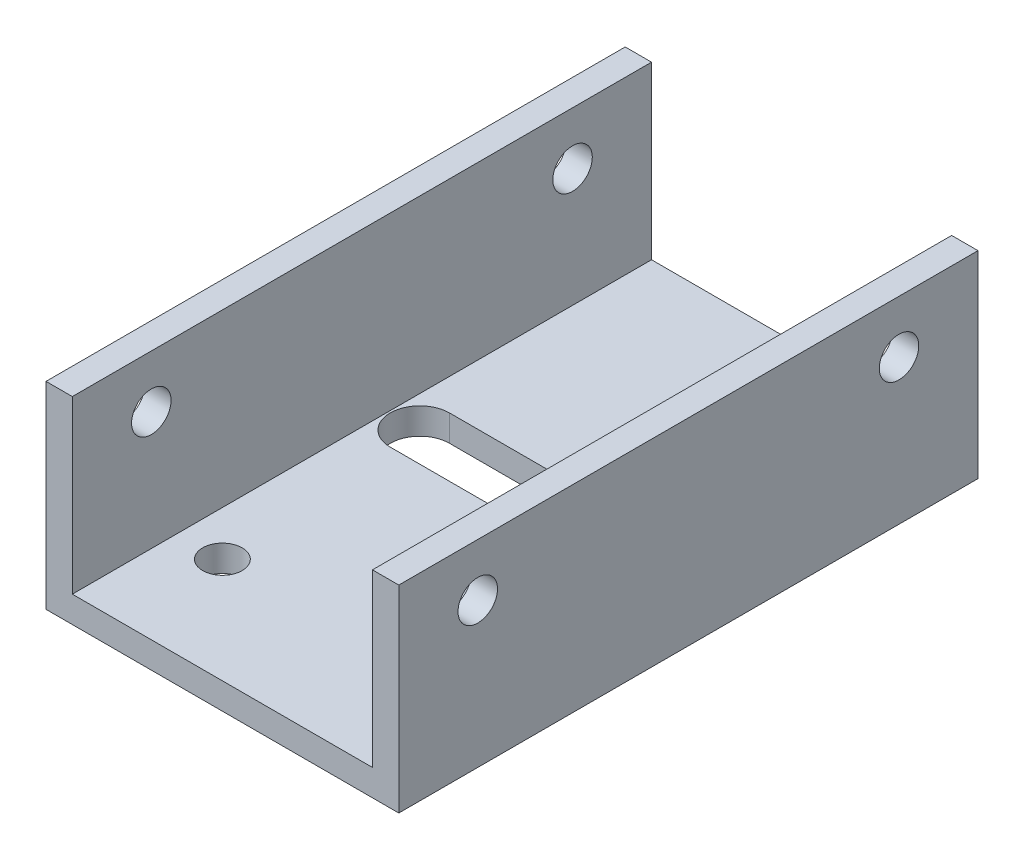
ISO-10303-21;
HEADER;
FILE_DESCRIPTION(('STEP AP214'),'2;1');
FILE_NAME('part.step','',(''),(''),'','','');
FILE_SCHEMA(('AUTOMOTIVE_DESIGN { 1 0 10303 214 1 1 1 1 }'));
ENDSEC;
DATA;
#1=APPLICATION_CONTEXT('core data for automotive mechanical design processes');
#2=APPLICATION_PROTOCOL_DEFINITION('international standard','automotive_design',2000,#1);
#3=PRODUCT_CONTEXT('',#1,'mechanical');
#4=PRODUCT('Part','Part','',(#3));
#5=PRODUCT_RELATED_PRODUCT_CATEGORY('part','',(#4));
#6=PRODUCT_DEFINITION_FORMATION('','',#4);
#7=PRODUCT_DEFINITION_CONTEXT('part definition',#1,'design');
#8=PRODUCT_DEFINITION('design','',#6,#7);
#9=PRODUCT_DEFINITION_SHAPE('','',#8);
#10=(LENGTH_UNIT() NAMED_UNIT(*) SI_UNIT(.MILLI.,.METRE.));
#11=(NAMED_UNIT(*) PLANE_ANGLE_UNIT() SI_UNIT($,.RADIAN.));
#12=(NAMED_UNIT(*) SI_UNIT($,.STERADIAN.) SOLID_ANGLE_UNIT());
#13=UNCERTAINTY_MEASURE_WITH_UNIT(LENGTH_MEASURE(1.E-05),#10,'distance_accuracy_value','');
#14=(GEOMETRIC_REPRESENTATION_CONTEXT(3) GLOBAL_UNCERTAINTY_ASSIGNED_CONTEXT((#13)) GLOBAL_UNIT_ASSIGNED_CONTEXT((#10,
#11,#12)) REPRESENTATION_CONTEXT('',''));
#15=CARTESIAN_POINT('',(0.,0.,0.));
#16=DIRECTION('',(0.,0.,1.));
#17=DIRECTION('',(1.,0.,0.));
#18=AXIS2_PLACEMENT_3D('',#15,#16,#17);
#19=CARTESIAN_POINT('',(0.,0.,44.));
#20=DIRECTION('',(0.,1.,0.));
#21=DIRECTION('',(0.,0.,1.));
#22=AXIS2_PLACEMENT_3D('',#19,#20,#21);
#23=PLANE('',#22);
#24=CARTESIAN_POINT('',(13.4,0.,8.));
#25=DIRECTION('',(0.,-1.,0.));
#26=DIRECTION('',(0.,0.,-1.));
#27=AXIS2_PLACEMENT_3D('',#24,#25,#26);
#28=CIRCLE('',#27,1.5);
#29=CARTESIAN_POINT('',(13.4,0.,6.5));
#30=VERTEX_POINT('',#29);
#31=EDGE_CURVE('E296',#30,#30,#28,.T.);
#32=ORIENTED_EDGE('',*,*,#31,.F.);
#33=EDGE_LOOP('',(#32));
#34=FACE_BOUND('',#33,.T.);
#35=CARTESIAN_POINT('',(21.4,0.,36.));
#36=DIRECTION('',(0.,-1.,0.));
#37=DIRECTION('',(0.,0.,-1.));
#38=AXIS2_PLACEMENT_3D('',#35,#36,#37);
#39=CIRCLE('',#38,1.5);
#40=CARTESIAN_POINT('',(21.4,0.,34.5));
#41=VERTEX_POINT('',#40);
#42=EDGE_CURVE('E301',#41,#41,#39,.T.);
#43=ORIENTED_EDGE('',*,*,#42,.F.);
#44=EDGE_LOOP('',(#43));
#45=FACE_BOUND('',#44,.T.);
#46=CARTESIAN_POINT('',(5.4,0.,36.));
#47=DIRECTION('',(0.,-1.,0.));
#48=DIRECTION('',(0.,0.,-1.));
#49=AXIS2_PLACEMENT_3D('',#46,#47,#48);
#50=CIRCLE('',#49,1.5);
#51=CARTESIAN_POINT('',(5.4,0.,34.5));
#52=VERTEX_POINT('',#51);
#53=EDGE_CURVE('E297',#52,#52,#50,.T.);
#54=ORIENTED_EDGE('',*,*,#53,.F.);
#55=EDGE_LOOP('',(#54));
#56=FACE_BOUND('',#55,.T.);
#57=DIRECTION('',(1.,0.,0.));
#58=VECTOR('',#57,1.);
#59=CARTESIAN_POINT('',(0.,0.,0.));
#60=LINE('',#59,#58);
#61=CARTESIAN_POINT('',(0.,0.,0.));
#62=VERTEX_POINT('',#61);
#63=CARTESIAN_POINT('',(26.8,0.,0.));
#64=VERTEX_POINT('',#63);
#65=EDGE_CURVE('E195',#62,#64,#60,.T.);
#66=ORIENTED_EDGE('',*,*,#65,.T.);
#67=DIRECTION('',(0.,0.,-1.));
#68=VECTOR('',#67,1.);
#69=CARTESIAN_POINT('',(26.8,0.,44.));
#70=LINE('',#69,#68);
#71=CARTESIAN_POINT('',(26.8,0.,44.));
#72=VERTEX_POINT('',#71);
#73=EDGE_CURVE('E239',#72,#64,#70,.T.);
#74=ORIENTED_EDGE('',*,*,#73,.F.);
#75=DIRECTION('',(1.,0.,0.));
#76=VECTOR('',#75,1.);
#77=CARTESIAN_POINT('',(0.,0.,44.));
#78=LINE('',#77,#76);
#79=CARTESIAN_POINT('',(0.,0.,44.));
#80=VERTEX_POINT('',#79);
#81=EDGE_CURVE('E168',#80,#72,#78,.T.);
#82=ORIENTED_EDGE('',*,*,#81,.F.);
#83=DIRECTION('',(0.,0.,-1.));
#84=VECTOR('',#83,1.);
#85=CARTESIAN_POINT('',(0.,0.,44.));
#86=LINE('',#85,#84);
#87=EDGE_CURVE('E243',#80,#62,#86,.T.);
#88=ORIENTED_EDGE('',*,*,#87,.T.);
#89=EDGE_LOOP('',(#66,#74,#82,#88));
#90=FACE_BOUND('',#89,.T.);
#91=DIRECTION('',(-1.,0.,0.));
#92=VECTOR('',#91,1.);
#93=CARTESIAN_POINT('',(0.,0.,17.75));
#94=LINE('',#93,#92);
#95=CARTESIAN_POINT('',(22.4,0.,17.75));
#96=VERTEX_POINT('',#95);
#97=CARTESIAN_POINT('',(4.4,0.,17.75));
#98=VERTEX_POINT('',#97);
#99=EDGE_CURVE('E57',#96,#98,#94,.T.);
#100=ORIENTED_EDGE('',*,*,#99,.T.);
#101=CARTESIAN_POINT('',(4.4,0.,20.));
#102=DIRECTION('',(0.,-1.,0.));
#103=DIRECTION('',(0.,0.,-1.));
#104=AXIS2_PLACEMENT_3D('',#101,#102,#103);
#105=CIRCLE('',#104,2.25);
#106=CARTESIAN_POINT('',(4.4,0.,22.25));
#107=VERTEX_POINT('',#106);
#108=EDGE_CURVE('E149',#107,#98,#105,.T.);
#109=ORIENTED_EDGE('',*,*,#108,.F.);
#110=DIRECTION('',(-1.,0.,0.));
#111=VECTOR('',#110,1.);
#112=CARTESIAN_POINT('',(0.,0.,22.25));
#113=LINE('',#112,#111);
#114=CARTESIAN_POINT('',(22.4,0.,22.25));
#115=VERTEX_POINT('',#114);
#116=EDGE_CURVE('E133',#115,#107,#113,.T.);
#117=ORIENTED_EDGE('',*,*,#116,.F.);
#118=CARTESIAN_POINT('',(22.4,0.,20.));
#119=DIRECTION('',(0.,-1.,0.));
#120=DIRECTION('',(0.,0.,-1.));
#121=AXIS2_PLACEMENT_3D('',#118,#119,#120);
#122=CIRCLE('',#121,2.25);
#123=EDGE_CURVE('E143',#96,#115,#122,.T.);
#124=ORIENTED_EDGE('',*,*,#123,.F.);
#125=EDGE_LOOP('',(#100,#109,#117,#124));
#126=FACE_BOUND('',#125,.T.);
#127=ADVANCED_FACE('F39',(#34,#45,#56,#90,#126),#23,.F.);
#128=CARTESIAN_POINT('',(2.,2.,44.));
#129=DIRECTION('',(0.,-1.,0.));
#130=DIRECTION('',(0.,0.,-1.));
#131=AXIS2_PLACEMENT_3D('',#128,#129,#130);
#132=PLANE('',#131);
#133=CARTESIAN_POINT('',(13.4,2.,8.));
#134=DIRECTION('',(0.,-1.,0.));
#135=DIRECTION('',(0.,0.,-1.));
#136=AXIS2_PLACEMENT_3D('',#133,#134,#135);
#137=CIRCLE('',#136,1.5);
#138=CARTESIAN_POINT('',(13.4,2.,6.5));
#139=VERTEX_POINT('',#138);
#140=EDGE_CURVE('E196',#139,#139,#137,.T.);
#141=ORIENTED_EDGE('',*,*,#140,.T.);
#142=EDGE_LOOP('',(#141));
#143=FACE_BOUND('',#142,.T.);
#144=CARTESIAN_POINT('',(21.4,2.,36.));
#145=DIRECTION('',(0.,-1.,0.));
#146=DIRECTION('',(0.,0.,-1.));
#147=AXIS2_PLACEMENT_3D('',#144,#145,#146);
#148=CIRCLE('',#147,1.5);
#149=CARTESIAN_POINT('',(21.4,2.,34.5));
#150=VERTEX_POINT('',#149);
#151=EDGE_CURVE('E258',#150,#150,#148,.T.);
#152=ORIENTED_EDGE('',*,*,#151,.T.);
#153=EDGE_LOOP('',(#152));
#154=FACE_BOUND('',#153,.T.);
#155=CARTESIAN_POINT('',(5.4,2.,36.));
#156=DIRECTION('',(0.,-1.,0.));
#157=DIRECTION('',(0.,0.,-1.));
#158=AXIS2_PLACEMENT_3D('',#155,#156,#157);
#159=CIRCLE('',#158,1.5);
#160=CARTESIAN_POINT('',(5.4,2.,34.5));
#161=VERTEX_POINT('',#160);
#162=EDGE_CURVE('E159',#161,#161,#159,.T.);
#163=ORIENTED_EDGE('',*,*,#162,.T.);
#164=EDGE_LOOP('',(#163));
#165=FACE_BOUND('',#164,.T.);
#166=DIRECTION('',(-1.,0.,0.));
#167=VECTOR('',#166,1.);
#168=CARTESIAN_POINT('',(2.,2.,0.));
#169=LINE('',#168,#167);
#170=CARTESIAN_POINT('',(24.8,2.,0.));
#171=VERTEX_POINT('',#170);
#172=CARTESIAN_POINT('',(2.,2.,0.));
#173=VERTEX_POINT('',#172);
#174=EDGE_CURVE('E208',#171,#173,#169,.T.);
#175=ORIENTED_EDGE('',*,*,#174,.T.);
#176=DIRECTION('',(0.,0.,-1.));
#177=VECTOR('',#176,1.);
#178=CARTESIAN_POINT('',(2.,2.,44.));
#179=LINE('',#178,#177);
#180=CARTESIAN_POINT('',(2.,2.,44.));
#181=VERTEX_POINT('',#180);
#182=EDGE_CURVE('E223',#181,#173,#179,.T.);
#183=ORIENTED_EDGE('',*,*,#182,.F.);
#184=DIRECTION('',(-1.,0.,0.));
#185=VECTOR('',#184,1.);
#186=CARTESIAN_POINT('',(2.,2.,44.));
#187=LINE('',#186,#185);
#188=CARTESIAN_POINT('',(24.8,2.,44.));
#189=VERTEX_POINT('',#188);
#190=EDGE_CURVE('E181',#189,#181,#187,.T.);
#191=ORIENTED_EDGE('',*,*,#190,.F.);
#192=DIRECTION('',(0.,0.,-1.));
#193=VECTOR('',#192,1.);
#194=CARTESIAN_POINT('',(24.8,2.,44.));
#195=LINE('',#194,#193);
#196=EDGE_CURVE('E227',#189,#171,#195,.T.);
#197=ORIENTED_EDGE('',*,*,#196,.T.);
#198=EDGE_LOOP('',(#175,#183,#191,#197));
#199=FACE_BOUND('',#198,.T.);
#200=DIRECTION('',(-1.,0.,0.));
#201=VECTOR('',#200,1.);
#202=CARTESIAN_POINT('',(2.00000000000001,2.,17.75));
#203=LINE('',#202,#201);
#204=CARTESIAN_POINT('',(22.4,2.,17.75));
#205=VERTEX_POINT('',#204);
#206=CARTESIAN_POINT('',(4.4,2.,17.75));
#207=VERTEX_POINT('',#206);
#208=EDGE_CURVE('E11',#205,#207,#203,.T.);
#209=ORIENTED_EDGE('',*,*,#208,.F.);
#210=CARTESIAN_POINT('',(22.4,2.,20.));
#211=DIRECTION('',(0.,-1.,0.));
#212=DIRECTION('',(0.,0.,-1.));
#213=AXIS2_PLACEMENT_3D('',#210,#211,#212);
#214=CIRCLE('',#213,2.25);
#215=CARTESIAN_POINT('',(22.4,2.,22.25));
#216=VERTEX_POINT('',#215);
#217=EDGE_CURVE('E247',#205,#216,#214,.T.);
#218=ORIENTED_EDGE('',*,*,#217,.T.);
#219=DIRECTION('',(-1.,0.,0.));
#220=VECTOR('',#219,1.);
#221=CARTESIAN_POINT('',(2.00000000000001,2.,22.25));
#222=LINE('',#221,#220);
#223=CARTESIAN_POINT('',(4.4,2.,22.25));
#224=VERTEX_POINT('',#223);
#225=EDGE_CURVE('E136',#216,#224,#222,.T.);
#226=ORIENTED_EDGE('',*,*,#225,.T.);
#227=CARTESIAN_POINT('',(4.4,2.,20.));
#228=DIRECTION('',(0.,-1.,0.));
#229=DIRECTION('',(0.,0.,-1.));
#230=AXIS2_PLACEMENT_3D('',#227,#228,#229);
#231=CIRCLE('',#230,2.25);
#232=EDGE_CURVE('E49',#224,#207,#231,.T.);
#233=ORIENTED_EDGE('',*,*,#232,.T.);
#234=EDGE_LOOP('',(#209,#218,#226,#233));
#235=FACE_BOUND('',#234,.T.);
#236=ADVANCED_FACE('F331',(#143,#154,#165,#199,#235),#132,.F.);
#237=CARTESIAN_POINT('',(0.,0.,44.));
#238=DIRECTION('',(1.,0.,0.));
#239=DIRECTION('',(0.,0.,-1.));
#240=AXIS2_PLACEMENT_3D('',#237,#238,#239);
#241=PLANE('',#240);
#242=CARTESIAN_POINT('',(0.,11.,6.));
#243=DIRECTION('',(-1.,0.,0.));
#244=DIRECTION('',(0.,0.,1.));
#245=AXIS2_PLACEMENT_3D('',#242,#243,#244);
#246=CIRCLE('',#245,1.5);
#247=CARTESIAN_POINT('',(0.,11.,7.5));
#248=VERTEX_POINT('',#247);
#249=EDGE_CURVE('E268',#248,#248,#246,.T.);
#250=ORIENTED_EDGE('',*,*,#249,.F.);
#251=EDGE_LOOP('',(#250));
#252=FACE_BOUND('',#251,.T.);
#253=CARTESIAN_POINT('',(0.,11.,38.));
#254=DIRECTION('',(-1.,0.,0.));
#255=DIRECTION('',(0.,0.,1.));
#256=AXIS2_PLACEMENT_3D('',#253,#254,#255);
#257=CIRCLE('',#256,1.5);
#258=CARTESIAN_POINT('',(0.,11.,39.5));
#259=VERTEX_POINT('',#258);
#260=EDGE_CURVE('E277',#259,#259,#257,.T.);
#261=ORIENTED_EDGE('',*,*,#260,.F.);
#262=EDGE_LOOP('',(#261));
#263=FACE_BOUND('',#262,.T.);
#264=DIRECTION('',(0.,-1.,0.));
#265=VECTOR('',#264,1.);
#266=CARTESIAN_POINT('',(0.,0.,0.));
#267=LINE('',#266,#265);
#268=CARTESIAN_POINT('',(0.,15.,0.));
#269=VERTEX_POINT('',#268);
#270=EDGE_CURVE('E191',#269,#62,#267,.T.);
#271=ORIENTED_EDGE('',*,*,#270,.T.);
#272=ORIENTED_EDGE('',*,*,#87,.F.);
#273=DIRECTION('',(0.,-1.,0.));
#274=VECTOR('',#273,1.);
#275=CARTESIAN_POINT('',(0.,0.,44.));
#276=LINE('',#275,#274);
#277=CARTESIAN_POINT('',(0.,15.,44.));
#278=VERTEX_POINT('',#277);
#279=EDGE_CURVE('E164',#278,#80,#276,.T.);
#280=ORIENTED_EDGE('',*,*,#279,.F.);
#281=DIRECTION('',(0.,0.,-1.));
#282=VECTOR('',#281,1.);
#283=CARTESIAN_POINT('',(0.,15.,44.));
#284=LINE('',#283,#282);
#285=EDGE_CURVE('E190',#278,#269,#284,.T.);
#286=ORIENTED_EDGE('',*,*,#285,.T.);
#287=EDGE_LOOP('',(#271,#272,#280,#286));
#288=FACE_BOUND('',#287,.T.);
#289=ADVANCED_FACE('F41',(#252,#263,#288),#241,.F.);
#290=CARTESIAN_POINT('',(26.8,0.,44.));
#291=DIRECTION('',(-1.,0.,0.));
#292=DIRECTION('',(0.,0.,1.));
#293=AXIS2_PLACEMENT_3D('',#290,#291,#292);
#294=PLANE('',#293);
#295=CARTESIAN_POINT('',(26.8,11.,6.));
#296=DIRECTION('',(-1.,0.,0.));
#297=DIRECTION('',(0.,0.,1.));
#298=AXIS2_PLACEMENT_3D('',#295,#296,#297);
#299=CIRCLE('',#298,1.5);
#300=CARTESIAN_POINT('',(26.8,11.,7.5));
#301=VERTEX_POINT('',#300);
#302=EDGE_CURVE('E292',#301,#301,#299,.T.);
#303=ORIENTED_EDGE('',*,*,#302,.T.);
#304=EDGE_LOOP('',(#303));
#305=FACE_BOUND('',#304,.T.);
#306=CARTESIAN_POINT('',(26.8,11.,38.));
#307=DIRECTION('',(-1.,0.,0.));
#308=DIRECTION('',(0.,0.,1.));
#309=AXIS2_PLACEMENT_3D('',#306,#307,#308);
#310=CIRCLE('',#309,1.5);
#311=CARTESIAN_POINT('',(26.8,11.,39.5));
#312=VERTEX_POINT('',#311);
#313=EDGE_CURVE('E274',#312,#312,#310,.T.);
#314=ORIENTED_EDGE('',*,*,#313,.T.);
#315=EDGE_LOOP('',(#314));
#316=FACE_BOUND('',#315,.T.);
#317=DIRECTION('',(0.,1.,0.));
#318=VECTOR('',#317,1.);
#319=CARTESIAN_POINT('',(26.8,0.,0.));
#320=LINE('',#319,#318);
#321=CARTESIAN_POINT('',(26.8,15.,0.));
#322=VERTEX_POINT('',#321);
#323=EDGE_CURVE('E199',#64,#322,#320,.T.);
#324=ORIENTED_EDGE('',*,*,#323,.T.);
#325=DIRECTION('',(0.,0.,-1.));
#326=VECTOR('',#325,1.);
#327=CARTESIAN_POINT('',(26.8,15.,44.));
#328=LINE('',#327,#326);
#329=CARTESIAN_POINT('',(26.8,15.,44.));
#330=VERTEX_POINT('',#329);
#331=EDGE_CURVE('E235',#330,#322,#328,.T.);
#332=ORIENTED_EDGE('',*,*,#331,.F.);
#333=DIRECTION('',(0.,1.,0.));
#334=VECTOR('',#333,1.);
#335=CARTESIAN_POINT('',(26.8,0.,44.));
#336=LINE('',#335,#334);
#337=EDGE_CURVE('E172',#72,#330,#336,.T.);
#338=ORIENTED_EDGE('',*,*,#337,.F.);
#339=ORIENTED_EDGE('',*,*,#73,.T.);
#340=EDGE_LOOP('',(#324,#332,#338,#339));
#341=FACE_BOUND('',#340,.T.);
#342=ADVANCED_FACE('F341',(#305,#316,#341),#294,.F.);
#343=CARTESIAN_POINT('',(24.8,15.,44.));
#344=DIRECTION('',(0.,-1.,0.));
#345=DIRECTION('',(0.,0.,-1.));
#346=AXIS2_PLACEMENT_3D('',#343,#344,#345);
#347=PLANE('',#346);
#348=DIRECTION('',(-1.,0.,0.));
#349=VECTOR('',#348,1.);
#350=CARTESIAN_POINT('',(24.8,15.,0.));
#351=LINE('',#350,#349);
#352=CARTESIAN_POINT('',(24.8,15.,0.));
#353=VERTEX_POINT('',#352);
#354=EDGE_CURVE('E202',#322,#353,#351,.T.);
#355=ORIENTED_EDGE('',*,*,#354,.T.);
#356=DIRECTION('',(0.,0.,-1.));
#357=VECTOR('',#356,1.);
#358=CARTESIAN_POINT('',(24.8,15.,44.));
#359=LINE('',#358,#357);
#360=CARTESIAN_POINT('',(24.8,15.,44.));
#361=VERTEX_POINT('',#360);
#362=EDGE_CURVE('E231',#361,#353,#359,.T.);
#363=ORIENTED_EDGE('',*,*,#362,.F.);
#364=DIRECTION('',(-1.,0.,0.));
#365=VECTOR('',#364,1.);
#366=CARTESIAN_POINT('',(24.8,15.,44.));
#367=LINE('',#366,#365);
#368=EDGE_CURVE('E175',#330,#361,#367,.T.);
#369=ORIENTED_EDGE('',*,*,#368,.F.);
#370=ORIENTED_EDGE('',*,*,#331,.T.);
#371=EDGE_LOOP('',(#355,#363,#369,#370));
#372=FACE_BOUND('',#371,.T.);
#373=ADVANCED_FACE('F344',(#372),#347,.F.);
#374=CARTESIAN_POINT('',(24.8,15.,44.));
#375=DIRECTION('',(1.,0.,0.));
#376=DIRECTION('',(0.,0.,-1.));
#377=AXIS2_PLACEMENT_3D('',#374,#375,#376);
#378=PLANE('',#377);
#379=CARTESIAN_POINT('',(24.8,11.,6.));
#380=DIRECTION('',(1.,0.,0.));
#381=DIRECTION('',(0.,0.,-1.));
#382=AXIS2_PLACEMENT_3D('',#379,#380,#381);
#383=CIRCLE('',#382,1.5);
#384=CARTESIAN_POINT('',(24.8,11.,4.5));
#385=VERTEX_POINT('',#384);
#386=EDGE_CURVE('E288',#385,#385,#383,.T.);
#387=ORIENTED_EDGE('',*,*,#386,.T.);
#388=EDGE_LOOP('',(#387));
#389=FACE_BOUND('',#388,.T.);
#390=CARTESIAN_POINT('',(24.8,11.,38.));
#391=DIRECTION('',(1.,0.,0.));
#392=DIRECTION('',(0.,0.,-1.));
#393=AXIS2_PLACEMENT_3D('',#390,#391,#392);
#394=CIRCLE('',#393,1.5);
#395=CARTESIAN_POINT('',(24.8,11.,36.5));
#396=VERTEX_POINT('',#395);
#397=EDGE_CURVE('E267',#396,#396,#394,.T.);
#398=ORIENTED_EDGE('',*,*,#397,.T.);
#399=EDGE_LOOP('',(#398));
#400=FACE_BOUND('',#399,.T.);
#401=DIRECTION('',(0.,-1.,0.));
#402=VECTOR('',#401,1.);
#403=CARTESIAN_POINT('',(24.8,15.,0.));
#404=LINE('',#403,#402);
#405=EDGE_CURVE('E205',#353,#171,#404,.T.);
#406=ORIENTED_EDGE('',*,*,#405,.T.);
#407=ORIENTED_EDGE('',*,*,#196,.F.);
#408=DIRECTION('',(0.,-1.,0.));
#409=VECTOR('',#408,1.);
#410=CARTESIAN_POINT('',(24.8,15.,44.));
#411=LINE('',#410,#409);
#412=EDGE_CURVE('E178',#361,#189,#411,.T.);
#413=ORIENTED_EDGE('',*,*,#412,.F.);
#414=ORIENTED_EDGE('',*,*,#362,.T.);
#415=EDGE_LOOP('',(#406,#407,#413,#414));
#416=FACE_BOUND('',#415,.T.);
#417=ADVANCED_FACE('F348',(#389,#400,#416),#378,.F.);
#418=CARTESIAN_POINT('',(2.,15.,44.));
#419=DIRECTION('',(-1.,0.,0.));
#420=DIRECTION('',(0.,-1.,0.));
#421=AXIS2_PLACEMENT_3D('',#418,#419,#420);
#422=PLANE('',#421);
#423=CARTESIAN_POINT('',(2.,11.,6.));
#424=DIRECTION('',(-1.,0.,0.));
#425=DIRECTION('',(0.,-1.,0.));
#426=AXIS2_PLACEMENT_3D('',#423,#424,#425);
#427=CIRCLE('',#426,1.5);
#428=CARTESIAN_POINT('',(2.,9.5,6.));
#429=VERTEX_POINT('',#428);
#430=EDGE_CURVE('E43',#429,#429,#427,.T.);
#431=ORIENTED_EDGE('',*,*,#430,.T.);
#432=EDGE_LOOP('',(#431));
#433=FACE_BOUND('',#432,.T.);
#434=CARTESIAN_POINT('',(2.,11.,38.));
#435=DIRECTION('',(-1.,0.,0.));
#436=DIRECTION('',(0.,-1.,0.));
#437=AXIS2_PLACEMENT_3D('',#434,#435,#436);
#438=CIRCLE('',#437,1.5);
#439=CARTESIAN_POINT('',(2.,9.49999999999999,38.));
#440=VERTEX_POINT('',#439);
#441=EDGE_CURVE('E264',#440,#440,#438,.T.);
#442=ORIENTED_EDGE('',*,*,#441,.T.);
#443=EDGE_LOOP('',(#442));
#444=FACE_BOUND('',#443,.T.);
#445=DIRECTION('',(0.,1.,0.));
#446=VECTOR('',#445,1.);
#447=CARTESIAN_POINT('',(2.,15.,0.));
#448=LINE('',#447,#446);
#449=CARTESIAN_POINT('',(2.,15.,0.));
#450=VERTEX_POINT('',#449);
#451=EDGE_CURVE('E211',#173,#450,#448,.T.);
#452=ORIENTED_EDGE('',*,*,#451,.T.);
#453=DIRECTION('',(0.,0.,-1.));
#454=VECTOR('',#453,1.);
#455=CARTESIAN_POINT('',(2.,15.,44.));
#456=LINE('',#455,#454);
#457=CARTESIAN_POINT('',(2.,15.,44.));
#458=VERTEX_POINT('',#457);
#459=EDGE_CURVE('E219',#458,#450,#456,.T.);
#460=ORIENTED_EDGE('',*,*,#459,.F.);
#461=DIRECTION('',(0.,1.,0.));
#462=VECTOR('',#461,1.);
#463=CARTESIAN_POINT('',(2.,15.,44.));
#464=LINE('',#463,#462);
#465=EDGE_CURVE('E184',#181,#458,#464,.T.);
#466=ORIENTED_EDGE('',*,*,#465,.F.);
#467=ORIENTED_EDGE('',*,*,#182,.T.);
#468=EDGE_LOOP('',(#452,#460,#466,#467));
#469=FACE_BOUND('',#468,.T.);
#470=ADVANCED_FACE('F312',(#433,#444,#469),#422,.F.);
#471=CARTESIAN_POINT('',(0.,15.,44.));
#472=DIRECTION('',(0.,-1.,0.));
#473=DIRECTION('',(0.,0.,-1.));
#474=AXIS2_PLACEMENT_3D('',#471,#472,#473);
#475=PLANE('',#474);
#476=DIRECTION('',(-1.,0.,0.));
#477=VECTOR('',#476,1.);
#478=CARTESIAN_POINT('',(0.,15.,0.));
#479=LINE('',#478,#477);
#480=EDGE_CURVE('E169',#450,#269,#479,.T.);
#481=ORIENTED_EDGE('',*,*,#480,.T.);
#482=ORIENTED_EDGE('',*,*,#285,.F.);
#483=DIRECTION('',(-1.,0.,0.));
#484=VECTOR('',#483,1.);
#485=CARTESIAN_POINT('',(0.,15.,44.));
#486=LINE('',#485,#484);
#487=EDGE_CURVE('E187',#458,#278,#486,.T.);
#488=ORIENTED_EDGE('',*,*,#487,.F.);
#489=ORIENTED_EDGE('',*,*,#459,.T.);
#490=EDGE_LOOP('',(#481,#482,#488,#489));
#491=FACE_BOUND('',#490,.T.);
#492=ADVANCED_FACE('F355',(#491),#475,.F.);
#493=CARTESIAN_POINT('',(0.,0.,44.));
#494=DIRECTION('',(0.,0.,-1.));
#495=DIRECTION('',(-1.,0.,0.));
#496=AXIS2_PLACEMENT_3D('',#493,#494,#495);
#497=PLANE('',#496);
#498=ORIENTED_EDGE('',*,*,#279,.T.);
#499=ORIENTED_EDGE('',*,*,#81,.T.);
#500=ORIENTED_EDGE('',*,*,#337,.T.);
#501=ORIENTED_EDGE('',*,*,#368,.T.);
#502=ORIENTED_EDGE('',*,*,#412,.T.);
#503=ORIENTED_EDGE('',*,*,#190,.T.);
#504=ORIENTED_EDGE('',*,*,#465,.T.);
#505=ORIENTED_EDGE('',*,*,#487,.T.);
#506=EDGE_LOOP('',(#498,#499,#500,#501,#502,#503,#504,#505));
#507=FACE_BOUND('',#506,.T.);
#508=ADVANCED_FACE('F358',(#507),#497,.F.);
#509=CARTESIAN_POINT('',(0.,0.,0.));
#510=DIRECTION('',(0.,0.,-1.));
#511=DIRECTION('',(-1.,0.,0.));
#512=AXIS2_PLACEMENT_3D('',#509,#510,#511);
#513=PLANE('',#512);
#514=ORIENTED_EDGE('',*,*,#270,.F.);
#515=ORIENTED_EDGE('',*,*,#480,.F.);
#516=ORIENTED_EDGE('',*,*,#451,.F.);
#517=ORIENTED_EDGE('',*,*,#174,.F.);
#518=ORIENTED_EDGE('',*,*,#405,.F.);
#519=ORIENTED_EDGE('',*,*,#354,.F.);
#520=ORIENTED_EDGE('',*,*,#323,.F.);
#521=ORIENTED_EDGE('',*,*,#65,.F.);
#522=EDGE_LOOP('',(#514,#515,#516,#517,#518,#519,#520,#521));
#523=FACE_BOUND('',#522,.T.);
#524=ADVANCED_FACE('F360',(#523),#513,.T.);
#525=CARTESIAN_POINT('',(0.,30.,17.75));
#526=DIRECTION('',(0.,0.,1.));
#527=DIRECTION('',(1.,0.,0.));
#528=AXIS2_PLACEMENT_3D('',#525,#526,#527);
#529=PLANE('',#528);
#530=ORIENTED_EDGE('',*,*,#208,.T.);
#531=DIRECTION('',(0.,-1.,0.));
#532=VECTOR('',#531,1.);
#533=CARTESIAN_POINT('',(4.4,30.,17.75));
#534=LINE('',#533,#532);
#535=EDGE_CURVE('E156',#207,#98,#534,.T.);
#536=ORIENTED_EDGE('',*,*,#535,.T.);
#537=ORIENTED_EDGE('',*,*,#99,.F.);
#538=DIRECTION('',(0.,-1.,0.));
#539=VECTOR('',#538,1.);
#540=CARTESIAN_POINT('',(22.4,30.,17.75));
#541=LINE('',#540,#539);
#542=EDGE_CURVE('E140',#205,#96,#541,.T.);
#543=ORIENTED_EDGE('',*,*,#542,.F.);
#544=EDGE_LOOP('',(#530,#536,#537,#543));
#545=FACE_BOUND('',#544,.T.);
#546=ADVANCED_FACE('F363',(#545),#529,.T.);
#547=CARTESIAN_POINT('',(4.4,30.,20.));
#548=DIRECTION('',(0.,-1.,0.));
#549=DIRECTION('',(0.,0.,-1.));
#550=AXIS2_PLACEMENT_3D('',#547,#548,#549);
#551=CYLINDRICAL_SURFACE('',#550,2.25);
#552=DIRECTION('',(0.,-1.,0.));
#553=VECTOR('',#552,1.);
#554=CARTESIAN_POINT('',(4.4,30.,22.25));
#555=LINE('',#554,#553);
#556=EDGE_CURVE('E139',#224,#107,#555,.T.);
#557=ORIENTED_EDGE('',*,*,#556,.T.);
#558=ORIENTED_EDGE('',*,*,#108,.T.);
#559=ORIENTED_EDGE('',*,*,#535,.F.);
#560=ORIENTED_EDGE('',*,*,#232,.F.);
#561=EDGE_LOOP('',(#557,#558,#559,#560));
#562=FACE_BOUND('',#561,.T.);
#563=ADVANCED_FACE('F370',(#562),#551,.F.);
#564=CARTESIAN_POINT('',(0.,30.,22.25));
#565=DIRECTION('',(0.,0.,1.));
#566=DIRECTION('',(1.,0.,0.));
#567=AXIS2_PLACEMENT_3D('',#564,#565,#566);
#568=PLANE('',#567);
#569=DIRECTION('',(0.,-1.,0.));
#570=VECTOR('',#569,1.);
#571=CARTESIAN_POINT('',(22.4,30.,22.25));
#572=LINE('',#571,#570);
#573=EDGE_CURVE('E65',#216,#115,#572,.T.);
#574=ORIENTED_EDGE('',*,*,#573,.T.);
#575=ORIENTED_EDGE('',*,*,#116,.T.);
#576=ORIENTED_EDGE('',*,*,#556,.F.);
#577=ORIENTED_EDGE('',*,*,#225,.F.);
#578=EDGE_LOOP('',(#574,#575,#576,#577));
#579=FACE_BOUND('',#578,.T.);
#580=ADVANCED_FACE('F130',(#579),#568,.F.);
#581=CARTESIAN_POINT('',(22.4,30.,20.));
#582=DIRECTION('',(0.,-1.,0.));
#583=DIRECTION('',(0.,0.,-1.));
#584=AXIS2_PLACEMENT_3D('',#581,#582,#583);
#585=CYLINDRICAL_SURFACE('',#584,2.25);
#586=ORIENTED_EDGE('',*,*,#542,.T.);
#587=ORIENTED_EDGE('',*,*,#123,.T.);
#588=ORIENTED_EDGE('',*,*,#573,.F.);
#589=ORIENTED_EDGE('',*,*,#217,.F.);
#590=EDGE_LOOP('',(#586,#587,#588,#589));
#591=FACE_BOUND('',#590,.T.);
#592=ADVANCED_FACE('F144',(#591),#585,.F.);
#593=CARTESIAN_POINT('',(5.4,30.,36.));
#594=DIRECTION('',(0.,-1.,0.));
#595=DIRECTION('',(0.,0.,-1.));
#596=AXIS2_PLACEMENT_3D('',#593,#594,#595);
#597=CYLINDRICAL_SURFACE('',#596,1.5);
#598=ORIENTED_EDGE('',*,*,#53,.T.);
#599=EDGE_LOOP('',(#598));
#600=FACE_BOUND('',#599,.T.);
#601=ORIENTED_EDGE('',*,*,#162,.F.);
#602=EDGE_LOOP('',(#601));
#603=FACE_BOUND('',#602,.T.);
#604=ADVANCED_FACE('F373',(#600,#603),#597,.F.);
#605=CARTESIAN_POINT('',(21.4,30.,36.));
#606=DIRECTION('',(0.,-1.,0.));
#607=DIRECTION('',(0.,0.,-1.));
#608=AXIS2_PLACEMENT_3D('',#605,#606,#607);
#609=CYLINDRICAL_SURFACE('',#608,1.5);
#610=ORIENTED_EDGE('',*,*,#42,.T.);
#611=EDGE_LOOP('',(#610));
#612=FACE_BOUND('',#611,.T.);
#613=ORIENTED_EDGE('',*,*,#151,.F.);
#614=EDGE_LOOP('',(#613));
#615=FACE_BOUND('',#614,.T.);
#616=ADVANCED_FACE('F381',(#612,#615),#609,.F.);
#617=CARTESIAN_POINT('',(13.4,30.,8.));
#618=DIRECTION('',(0.,-1.,0.));
#619=DIRECTION('',(0.,0.,-1.));
#620=AXIS2_PLACEMENT_3D('',#617,#618,#619);
#621=CYLINDRICAL_SURFACE('',#620,1.5);
#622=ORIENTED_EDGE('',*,*,#31,.T.);
#623=EDGE_LOOP('',(#622));
#624=FACE_BOUND('',#623,.T.);
#625=ORIENTED_EDGE('',*,*,#140,.F.);
#626=EDGE_LOOP('',(#625));
#627=FACE_BOUND('',#626,.T.);
#628=ADVANCED_FACE('F326',(#624,#627),#621,.F.);
#629=CARTESIAN_POINT('',(30.,11.,38.));
#630=DIRECTION('',(-1.,0.,0.));
#631=DIRECTION('',(0.,0.,1.));
#632=AXIS2_PLACEMENT_3D('',#629,#630,#631);
#633=CYLINDRICAL_SURFACE('',#632,1.5);
#634=ORIENTED_EDGE('',*,*,#260,.T.);
#635=EDGE_LOOP('',(#634));
#636=FACE_BOUND('',#635,.T.);
#637=ORIENTED_EDGE('',*,*,#441,.F.);
#638=EDGE_LOOP('',(#637));
#639=FACE_BOUND('',#638,.T.);
#640=ADVANCED_FACE('F317',(#636,#639),#633,.F.);
#641=CARTESIAN_POINT('',(30.,11.,6.));
#642=DIRECTION('',(-1.,0.,0.));
#643=DIRECTION('',(0.,0.,1.));
#644=AXIS2_PLACEMENT_3D('',#641,#642,#643);
#645=CYLINDRICAL_SURFACE('',#644,1.5);
#646=ORIENTED_EDGE('',*,*,#249,.T.);
#647=EDGE_LOOP('',(#646));
#648=FACE_BOUND('',#647,.T.);
#649=ORIENTED_EDGE('',*,*,#430,.F.);
#650=EDGE_LOOP('',(#649));
#651=FACE_BOUND('',#650,.T.);
#652=ADVANCED_FACE('F314',(#648,#651),#645,.F.);
#653=ORIENTED_EDGE('',*,*,#397,.F.);
#654=EDGE_LOOP('',(#653));
#655=FACE_BOUND('',#654,.T.);
#656=ORIENTED_EDGE('',*,*,#313,.F.);
#657=EDGE_LOOP('',(#656));
#658=FACE_BOUND('',#657,.T.);
#659=ADVANCED_FACE('F316',(#655,#658),#633,.F.);
#660=ORIENTED_EDGE('',*,*,#386,.F.);
#661=EDGE_LOOP('',(#660));
#662=FACE_BOUND('',#661,.T.);
#663=ORIENTED_EDGE('',*,*,#302,.F.);
#664=EDGE_LOOP('',(#663));
#665=FACE_BOUND('',#664,.T.);
#666=ADVANCED_FACE('F319',(#662,#665),#645,.F.);
#667=CLOSED_SHELL('',(#127,#236,#289,#342,#373,#417,#470,#492,#508,#524,#546,#563,#580,#592,
#604,#616,#628,#640,#652,#659,#666));
#668=MANIFOLD_SOLID_BREP('B2',#667);
#669=ADVANCED_BREP_SHAPE_REPRESENTATION('',(#18,#668),#14);
#670=SHAPE_DEFINITION_REPRESENTATION(#9,#669);
ENDSEC;
END-ISO-10303-21;
